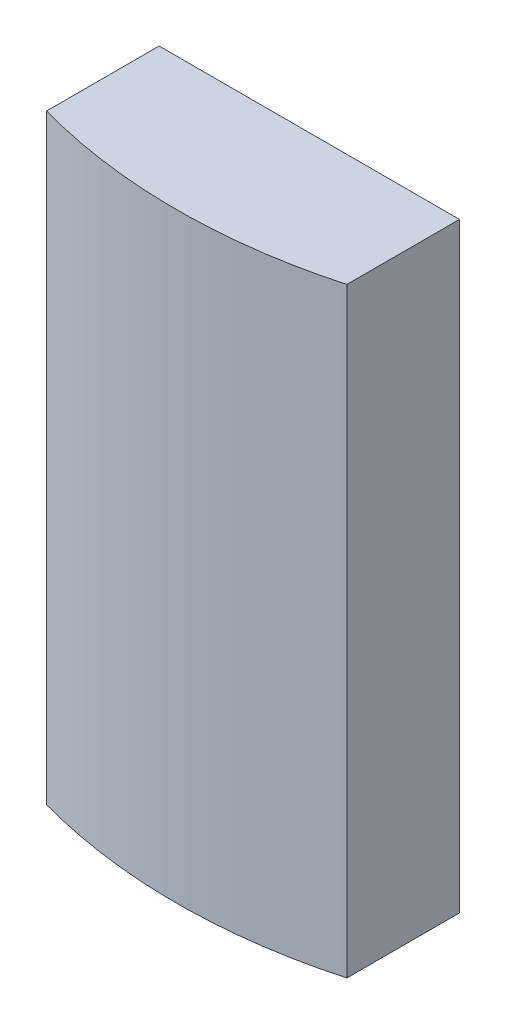
ISO-10303-21;
HEADER;
FILE_DESCRIPTION(('STEP AP214'),'2;1');
FILE_NAME('part.step','',(''),(''),'','','');
FILE_SCHEMA(('AUTOMOTIVE_DESIGN { 1 0 10303 214 1 1 1 1 }'));
ENDSEC;
DATA;
#1=APPLICATION_CONTEXT('core data for automotive mechanical design processes');
#2=APPLICATION_PROTOCOL_DEFINITION('international standard','automotive_design',2000,#1);
#3=PRODUCT_CONTEXT('',#1,'mechanical');
#4=PRODUCT('Part','Part','',(#3));
#5=PRODUCT_RELATED_PRODUCT_CATEGORY('part','',(#4));
#6=PRODUCT_DEFINITION_FORMATION('','',#4);
#7=PRODUCT_DEFINITION_CONTEXT('part definition',#1,'design');
#8=PRODUCT_DEFINITION('design','',#6,#7);
#9=PRODUCT_DEFINITION_SHAPE('','',#8);
#10=(LENGTH_UNIT() NAMED_UNIT(*) SI_UNIT(.MILLI.,.METRE.));
#11=(NAMED_UNIT(*) PLANE_ANGLE_UNIT() SI_UNIT($,.RADIAN.));
#12=(NAMED_UNIT(*) SI_UNIT($,.STERADIAN.) SOLID_ANGLE_UNIT());
#13=UNCERTAINTY_MEASURE_WITH_UNIT(LENGTH_MEASURE(1.E-05),#10,'distance_accuracy_value','');
#14=(GEOMETRIC_REPRESENTATION_CONTEXT(3) GLOBAL_UNCERTAINTY_ASSIGNED_CONTEXT((#13)) GLOBAL_UNIT_ASSIGNED_CONTEXT((#10,
#11,#12)) REPRESENTATION_CONTEXT('',''));
#15=CARTESIAN_POINT('',(0.,0.,0.));
#16=DIRECTION('',(0.,0.,1.));
#17=DIRECTION('',(1.,0.,0.));
#18=AXIS2_PLACEMENT_3D('',#15,#16,#17);
#19=CARTESIAN_POINT('',(0.,80.,0.));
#20=DIRECTION('',(1.,0.,0.));
#21=DIRECTION('',(0.,0.,-1.));
#22=AXIS2_PLACEMENT_3D('',#19,#20,#21);
#23=PLANE('',#22);
#24=DIRECTION('',(0.,0.,1.));
#25=VECTOR('',#24,1.);
#26=CARTESIAN_POINT('',(0.,0.,0.));
#27=LINE('',#26,#25);
#28=CARTESIAN_POINT('',(0.,0.,0.));
#29=VERTEX_POINT('',#28);
#30=CARTESIAN_POINT('',(0.,0.,15.));
#31=VERTEX_POINT('',#30);
#32=EDGE_CURVE('E101',#29,#31,#27,.T.);
#33=ORIENTED_EDGE('',*,*,#32,.T.);
#34=DIRECTION('',(0.,-1.,0.));
#35=VECTOR('',#34,1.);
#36=CARTESIAN_POINT('',(0.,80.,15.));
#37=LINE('',#36,#35);
#38=CARTESIAN_POINT('',(0.,80.,15.));
#39=VERTEX_POINT('',#38);
#40=EDGE_CURVE('E11',#39,#31,#37,.T.);
#41=ORIENTED_EDGE('',*,*,#40,.F.);
#42=DIRECTION('',(0.,0.,1.));
#43=VECTOR('',#42,1.);
#44=CARTESIAN_POINT('',(0.,80.,0.));
#45=LINE('',#44,#43);
#46=CARTESIAN_POINT('',(0.,80.,0.));
#47=VERTEX_POINT('',#46);
#48=EDGE_CURVE('E88',#47,#39,#45,.T.);
#49=ORIENTED_EDGE('',*,*,#48,.F.);
#50=DIRECTION('',(0.,-1.,0.));
#51=VECTOR('',#50,1.);
#52=CARTESIAN_POINT('',(0.,80.,0.));
#53=LINE('',#52,#51);
#54=EDGE_CURVE('E97',#47,#29,#53,.T.);
#55=ORIENTED_EDGE('',*,*,#54,.T.);
#56=EDGE_LOOP('',(#33,#41,#49,#55));
#57=FACE_BOUND('',#56,.T.);
#58=ADVANCED_FACE('F37',(#57),#23,.F.);
#59=CARTESIAN_POINT('',(20.,80.,-57.2841614740048));
#60=DIRECTION('',(0.,-1.,0.));
#61=DIRECTION('',(0.,0.,-1.));
#62=AXIS2_PLACEMENT_3D('',#59,#60,#61);
#63=CYLINDRICAL_SURFACE('',#62,75.);
#64=CARTESIAN_POINT('',(20.,0.,-57.2841614740048));
#65=DIRECTION('',(0.,1.,0.));
#66=DIRECTION('',(0.,0.,1.));
#67=AXIS2_PLACEMENT_3D('',#64,#65,#66);
#68=CIRCLE('',#67,75.);
#69=CARTESIAN_POINT('',(40.,0.,15.));
#70=VERTEX_POINT('',#69);
#71=EDGE_CURVE('E92',#31,#70,#68,.T.);
#72=ORIENTED_EDGE('',*,*,#71,.T.);
#73=DIRECTION('',(0.,-1.,0.));
#74=VECTOR('',#73,1.);
#75=CARTESIAN_POINT('',(40.,80.,15.));
#76=LINE('',#75,#74);
#77=CARTESIAN_POINT('',(40.,80.,15.));
#78=VERTEX_POINT('',#77);
#79=EDGE_CURVE('E45',#78,#70,#76,.T.);
#80=ORIENTED_EDGE('',*,*,#79,.F.);
#81=CARTESIAN_POINT('',(20.,80.,-57.2841614740048));
#82=DIRECTION('',(0.,1.,0.));
#83=DIRECTION('',(0.,0.,1.));
#84=AXIS2_PLACEMENT_3D('',#81,#82,#83);
#85=CIRCLE('',#84,75.);
#86=EDGE_CURVE('E83',#39,#78,#85,.T.);
#87=ORIENTED_EDGE('',*,*,#86,.F.);
#88=ORIENTED_EDGE('',*,*,#40,.T.);
#89=EDGE_LOOP('',(#72,#80,#87,#88));
#90=FACE_BOUND('',#89,.T.);
#91=ADVANCED_FACE('F91',(#90),#63,.T.);
#92=CARTESIAN_POINT('',(40.,80.,0.));
#93=DIRECTION('',(-1.,0.,0.));
#94=DIRECTION('',(0.,0.,1.));
#95=AXIS2_PLACEMENT_3D('',#92,#93,#94);
#96=PLANE('',#95);
#97=DIRECTION('',(0.,0.,-1.));
#98=VECTOR('',#97,1.);
#99=CARTESIAN_POINT('',(40.,0.,0.));
#100=LINE('',#99,#98);
#101=CARTESIAN_POINT('',(40.,0.,0.));
#102=VERTEX_POINT('',#101);
#103=EDGE_CURVE('E70',#70,#102,#100,.T.);
#104=ORIENTED_EDGE('',*,*,#103,.T.);
#105=DIRECTION('',(0.,-1.,0.));
#106=VECTOR('',#105,1.);
#107=CARTESIAN_POINT('',(40.,80.,0.));
#108=LINE('',#107,#106);
#109=CARTESIAN_POINT('',(40.,80.,0.));
#110=VERTEX_POINT('',#109);
#111=EDGE_CURVE('E94',#110,#102,#108,.T.);
#112=ORIENTED_EDGE('',*,*,#111,.F.);
#113=DIRECTION('',(0.,0.,-1.));
#114=VECTOR('',#113,1.);
#115=CARTESIAN_POINT('',(40.,80.,0.));
#116=LINE('',#115,#114);
#117=EDGE_CURVE('E86',#78,#110,#116,.T.);
#118=ORIENTED_EDGE('',*,*,#117,.F.);
#119=ORIENTED_EDGE('',*,*,#79,.T.);
#120=EDGE_LOOP('',(#104,#112,#118,#119));
#121=FACE_BOUND('',#120,.T.);
#122=ADVANCED_FACE('F95',(#121),#96,.F.);
#123=CARTESIAN_POINT('',(0.,80.,0.));
#124=DIRECTION('',(0.,0.,1.));
#125=DIRECTION('',(1.,0.,0.));
#126=AXIS2_PLACEMENT_3D('',#123,#124,#125);
#127=PLANE('',#126);
#128=DIRECTION('',(-1.,0.,0.));
#129=VECTOR('',#128,1.);
#130=CARTESIAN_POINT('',(0.,0.,0.));
#131=LINE('',#130,#129);
#132=EDGE_CURVE('E76',#102,#29,#131,.T.);
#133=ORIENTED_EDGE('',*,*,#132,.T.);
#134=ORIENTED_EDGE('',*,*,#54,.F.);
#135=DIRECTION('',(-1.,0.,0.));
#136=VECTOR('',#135,1.);
#137=CARTESIAN_POINT('',(0.,80.,0.));
#138=LINE('',#137,#136);
#139=EDGE_CURVE('E53',#110,#47,#138,.T.);
#140=ORIENTED_EDGE('',*,*,#139,.F.);
#141=ORIENTED_EDGE('',*,*,#111,.T.);
#142=EDGE_LOOP('',(#133,#134,#140,#141));
#143=FACE_BOUND('',#142,.T.);
#144=ADVANCED_FACE('F110',(#143),#127,.F.);
#145=CARTESIAN_POINT('',(20.,80.,-57.2841614740048));
#146=DIRECTION('',(0.,1.,0.));
#147=DIRECTION('',(0.,0.,1.));
#148=AXIS2_PLACEMENT_3D('',#145,#146,#147);
#149=PLANE('',#148);
#150=ORIENTED_EDGE('',*,*,#48,.T.);
#151=ORIENTED_EDGE('',*,*,#86,.T.);
#152=ORIENTED_EDGE('',*,*,#117,.T.);
#153=ORIENTED_EDGE('',*,*,#139,.T.);
#154=EDGE_LOOP('',(#150,#151,#152,#153));
#155=FACE_BOUND('',#154,.T.);
#156=ADVANCED_FACE('F84',(#155),#149,.T.);
#157=CARTESIAN_POINT('',(20.,0.,-57.2841614740048));
#158=DIRECTION('',(0.,1.,0.));
#159=DIRECTION('',(0.,0.,1.));
#160=AXIS2_PLACEMENT_3D('',#157,#158,#159);
#161=PLANE('',#160);
#162=ORIENTED_EDGE('',*,*,#32,.F.);
#163=ORIENTED_EDGE('',*,*,#132,.F.);
#164=ORIENTED_EDGE('',*,*,#103,.F.);
#165=ORIENTED_EDGE('',*,*,#71,.F.);
#166=EDGE_LOOP('',(#162,#163,#164,#165));
#167=FACE_BOUND('',#166,.T.);
#168=ADVANCED_FACE('F113',(#167),#161,.F.);
#169=CLOSED_SHELL('',(#58,#91,#122,#144,#156,#168));
#170=MANIFOLD_SOLID_BREP('B2',#169);
#171=ADVANCED_BREP_SHAPE_REPRESENTATION('',(#18,#170),#14);
#172=SHAPE_DEFINITION_REPRESENTATION(#9,#171);
ENDSEC;
END-ISO-10303-21;
